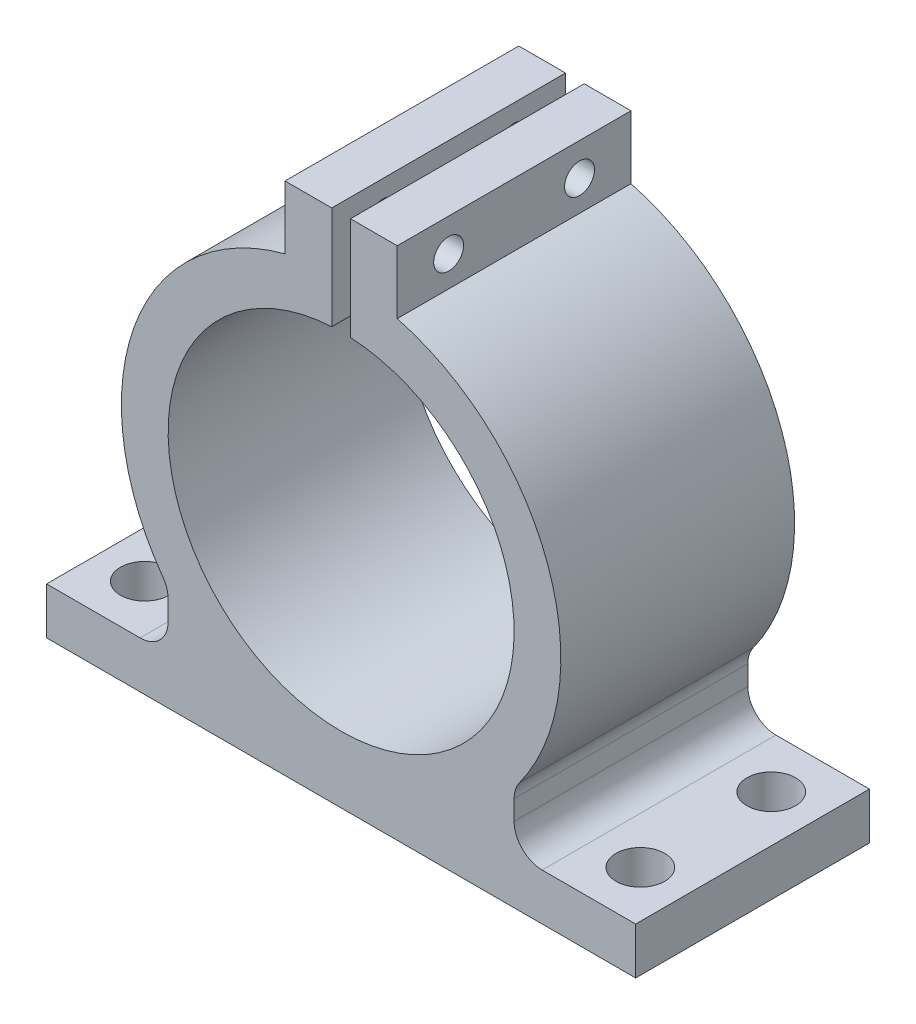
ISO-10303-21;
HEADER;
FILE_DESCRIPTION(('STEP AP214'),'2;1');
FILE_NAME('part.step','',(''),(''),'','','');
FILE_SCHEMA(('AUTOMOTIVE_DESIGN { 1 0 10303 214 1 1 1 1 }'));
ENDSEC;
DATA;
#1=APPLICATION_CONTEXT('core data for automotive mechanical design processes');
#2=APPLICATION_PROTOCOL_DEFINITION('international standard','automotive_design',2000,#1);
#3=PRODUCT_CONTEXT('',#1,'mechanical');
#4=PRODUCT('Part','Part','',(#3));
#5=PRODUCT_RELATED_PRODUCT_CATEGORY('part','',(#4));
#6=PRODUCT_DEFINITION_FORMATION('','',#4);
#7=PRODUCT_DEFINITION_CONTEXT('part definition',#1,'design');
#8=PRODUCT_DEFINITION('design','',#6,#7);
#9=PRODUCT_DEFINITION_SHAPE('','',#8);
#10=(LENGTH_UNIT() NAMED_UNIT(*) SI_UNIT(.MILLI.,.METRE.));
#11=(NAMED_UNIT(*) PLANE_ANGLE_UNIT() SI_UNIT($,.RADIAN.));
#12=(NAMED_UNIT(*) SI_UNIT($,.STERADIAN.) SOLID_ANGLE_UNIT());
#13=UNCERTAINTY_MEASURE_WITH_UNIT(LENGTH_MEASURE(1.E-05),#10,'distance_accuracy_value','');
#14=(GEOMETRIC_REPRESENTATION_CONTEXT(3) GLOBAL_UNCERTAINTY_ASSIGNED_CONTEXT((#13)) GLOBAL_UNIT_ASSIGNED_CONTEXT((#10,
#11,#12)) REPRESENTATION_CONTEXT('',''));
#15=CARTESIAN_POINT('',(0.,0.,0.));
#16=DIRECTION('',(0.,0.,1.));
#17=DIRECTION('',(1.,0.,0.));
#18=AXIS2_PLACEMENT_3D('',#15,#16,#17);
#19=CARTESIAN_POINT('',(-18.5,-25.6,25.));
#20=DIRECTION('',(1.,0.,0.));
#21=DIRECTION('',(0.,0.,-1.));
#22=AXIS2_PLACEMENT_3D('',#19,#20,#21);
#23=PLANE('',#22);
#24=DIRECTION('',(0.,-1.,0.));
#25=VECTOR('',#24,1.);
#26=CARTESIAN_POINT('',(-18.5,-25.6,25.));
#27=LINE('',#26,#25);
#28=CARTESIAN_POINT('',(-18.5,-15.4919333848297,25.));
#29=VERTEX_POINT('',#28);
#30=CARTESIAN_POINT('',(-18.5,-17.6,25.));
#31=VERTEX_POINT('',#30);
#32=EDGE_CURVE('E190',#29,#31,#27,.T.);
#33=ORIENTED_EDGE('',*,*,#32,.F.);
#34=DIRECTION('',(0.,0.,1.));
#35=VECTOR('',#34,1.);
#36=CARTESIAN_POINT('',(-18.5,-15.4919333848297,0.));
#37=LINE('',#36,#35);
#38=CARTESIAN_POINT('',(-18.5,-15.4919333848297,0.));
#39=VERTEX_POINT('',#38);
#40=EDGE_CURVE('E316',#29,#39,#37,.F.);
#41=ORIENTED_EDGE('',*,*,#40,.T.);
#42=DIRECTION('',(0.,-1.,0.));
#43=VECTOR('',#42,1.);
#44=CARTESIAN_POINT('',(-18.5,-25.6,0.));
#45=LINE('',#44,#43);
#46=CARTESIAN_POINT('',(-18.5,-17.6,0.));
#47=VERTEX_POINT('',#46);
#48=EDGE_CURVE('E277',#39,#47,#45,.T.);
#49=ORIENTED_EDGE('',*,*,#48,.T.);
#50=DIRECTION('',(0.,0.,-1.));
#51=VECTOR('',#50,1.);
#52=CARTESIAN_POINT('',(-18.5,-17.6,25.));
#53=LINE('',#52,#51);
#54=EDGE_CURVE('E314',#47,#31,#53,.F.);
#55=ORIENTED_EDGE('',*,*,#54,.T.);
#56=EDGE_LOOP('',(#33,#41,#49,#55));
#57=FACE_BOUND('',#56,.T.);
#58=ADVANCED_FACE('F39',(#57),#23,.F.);
#59=CARTESIAN_POINT('',(0.,0.,25.));
#60=DIRECTION('',(0.,0.,-1.));
#61=DIRECTION('',(-1.,0.,0.));
#62=AXIS2_PLACEMENT_3D('',#59,#60,#61);
#63=CYLINDRICAL_SURFACE('',#62,18.5);
#64=CARTESIAN_POINT('',(0.,0.,0.));
#65=DIRECTION('',(0.,0.,-1.));
#66=DIRECTION('',(-1.,0.,0.));
#67=AXIS2_PLACEMENT_3D('',#64,#65,#66);
#68=CIRCLE('',#67,18.5);
#69=CARTESIAN_POINT('',(0.999999999999998,18.4729532019112,0.));
#70=VERTEX_POINT('',#69);
#71=CARTESIAN_POINT('',(-1.,18.4729532019112,0.));
#72=VERTEX_POINT('',#71);
#73=EDGE_CURVE('E240',#70,#72,#68,.T.);
#74=ORIENTED_EDGE('',*,*,#73,.T.);
#75=DIRECTION('',(0.,0.,-1.));
#76=VECTOR('',#75,1.);
#77=CARTESIAN_POINT('',(-1.,18.4729532019112,25.));
#78=LINE('',#77,#76);
#79=CARTESIAN_POINT('',(-1.,18.4729532019112,25.));
#80=VERTEX_POINT('',#79);
#81=EDGE_CURVE('E311',#80,#72,#78,.T.);
#82=ORIENTED_EDGE('',*,*,#81,.F.);
#83=CARTESIAN_POINT('',(0.,0.,25.));
#84=DIRECTION('',(0.,0.,-1.));
#85=DIRECTION('',(-1.,0.,0.));
#86=AXIS2_PLACEMENT_3D('',#83,#84,#85);
#87=CIRCLE('',#86,18.5);
#88=CARTESIAN_POINT('',(0.999999999999998,18.4729532019112,25.));
#89=VERTEX_POINT('',#88);
#90=EDGE_CURVE('E241',#89,#80,#87,.T.);
#91=ORIENTED_EDGE('',*,*,#90,.F.);
#92=DIRECTION('',(0.,0.,-1.));
#93=VECTOR('',#92,1.);
#94=CARTESIAN_POINT('',(0.999999999999998,18.4729532019112,25.));
#95=LINE('',#94,#93);
#96=EDGE_CURVE('E265',#89,#70,#95,.T.);
#97=ORIENTED_EDGE('',*,*,#96,.T.);
#98=EDGE_LOOP('',(#74,#82,#91,#97));
#99=FACE_BOUND('',#98,.T.);
#100=ADVANCED_FACE('F397',(#99),#63,.F.);
#101=CARTESIAN_POINT('',(-1.,18.4729532019112,25.));
#102=DIRECTION('',(-1.,0.,0.));
#103=DIRECTION('',(0.,-1.,0.));
#104=AXIS2_PLACEMENT_3D('',#101,#102,#103);
#105=PLANE('',#104);
#106=CARTESIAN_POINT('',(-1.,25.9729532019112,19.5));
#107=DIRECTION('',(-1.,0.,0.));
#108=DIRECTION('',(0.,-1.,0.));
#109=AXIS2_PLACEMENT_3D('',#106,#107,#108);
#110=CIRCLE('',#109,1.6);
#111=CARTESIAN_POINT('',(-1.,24.3729532019112,19.5));
#112=VERTEX_POINT('',#111);
#113=EDGE_CURVE('E367',#112,#112,#110,.T.);
#114=ORIENTED_EDGE('',*,*,#113,.T.);
#115=EDGE_LOOP('',(#114));
#116=FACE_BOUND('',#115,.T.);
#117=CARTESIAN_POINT('',(-1.,25.9729532019112,5.5));
#118=DIRECTION('',(-1.,0.,0.));
#119=DIRECTION('',(0.,-1.,0.));
#120=AXIS2_PLACEMENT_3D('',#117,#118,#119);
#121=CIRCLE('',#120,1.6);
#122=CARTESIAN_POINT('',(-1.,24.3729532019112,5.5));
#123=VERTEX_POINT('',#122);
#124=EDGE_CURVE('E352',#123,#123,#121,.T.);
#125=ORIENTED_EDGE('',*,*,#124,.T.);
#126=EDGE_LOOP('',(#125));
#127=FACE_BOUND('',#126,.T.);
#128=DIRECTION('',(0.,1.,0.));
#129=VECTOR('',#128,1.);
#130=CARTESIAN_POINT('',(-1.,18.4729532019112,0.));
#131=LINE('',#130,#129);
#132=CARTESIAN_POINT('',(-1.00000000000001,29.4729532019112,0.));
#133=VERTEX_POINT('',#132);
#134=EDGE_CURVE('E268',#72,#133,#131,.T.);
#135=ORIENTED_EDGE('',*,*,#134,.T.);
#136=DIRECTION('',(0.,0.,-1.));
#137=VECTOR('',#136,1.);
#138=CARTESIAN_POINT('',(-1.00000000000001,29.4729532019112,25.));
#139=LINE('',#138,#137);
#140=CARTESIAN_POINT('',(-1.00000000000001,29.4729532019112,25.));
#141=VERTEX_POINT('',#140);
#142=EDGE_CURVE('E308',#141,#133,#139,.T.);
#143=ORIENTED_EDGE('',*,*,#142,.F.);
#144=DIRECTION('',(0.,1.,0.));
#145=VECTOR('',#144,1.);
#146=CARTESIAN_POINT('',(-1.,18.4729532019112,25.));
#147=LINE('',#146,#145);
#148=EDGE_CURVE('E243',#80,#141,#147,.T.);
#149=ORIENTED_EDGE('',*,*,#148,.F.);
#150=ORIENTED_EDGE('',*,*,#81,.T.);
#151=EDGE_LOOP('',(#135,#143,#149,#150));
#152=FACE_BOUND('',#151,.T.);
#153=ADVANCED_FACE('F403',(#116,#127,#152),#105,.F.);
#154=CARTESIAN_POINT('',(-1.00000000000001,29.4729532019112,25.));
#155=DIRECTION('',(0.,-1.,0.));
#156=DIRECTION('',(0.,0.,-1.));
#157=AXIS2_PLACEMENT_3D('',#154,#155,#156);
#158=PLANE('',#157);
#159=DIRECTION('',(-1.,0.,0.));
#160=VECTOR('',#159,1.);
#161=CARTESIAN_POINT('',(-1.00000000000001,29.4729532019112,0.));
#162=LINE('',#161,#160);
#163=CARTESIAN_POINT('',(-6.00000000000001,29.4729532019112,0.));
#164=VERTEX_POINT('',#163);
#165=EDGE_CURVE('E270',#133,#164,#162,.T.);
#166=ORIENTED_EDGE('',*,*,#165,.T.);
#167=DIRECTION('',(0.,0.,-1.));
#168=VECTOR('',#167,1.);
#169=CARTESIAN_POINT('',(-6.00000000000001,29.4729532019112,25.));
#170=LINE('',#169,#168);
#171=CARTESIAN_POINT('',(-6.00000000000001,29.4729532019112,25.));
#172=VERTEX_POINT('',#171);
#173=EDGE_CURVE('E305',#172,#164,#170,.T.);
#174=ORIENTED_EDGE('',*,*,#173,.F.);
#175=DIRECTION('',(-1.,0.,0.));
#176=VECTOR('',#175,1.);
#177=CARTESIAN_POINT('',(-1.00000000000001,29.4729532019112,25.));
#178=LINE('',#177,#176);
#179=EDGE_CURVE('E246',#141,#172,#178,.T.);
#180=ORIENTED_EDGE('',*,*,#179,.F.);
#181=ORIENTED_EDGE('',*,*,#142,.T.);
#182=EDGE_LOOP('',(#166,#174,#180,#181));
#183=FACE_BOUND('',#182,.T.);
#184=ADVANCED_FACE('F417',(#183),#158,.F.);
#185=CARTESIAN_POINT('',(-6.00000000000001,29.4729532019112,25.));
#186=DIRECTION('',(1.,0.,0.));
#187=DIRECTION('',(0.,1.,0.));
#188=AXIS2_PLACEMENT_3D('',#185,#186,#187);
#189=PLANE('',#188);
#190=CARTESIAN_POINT('',(-6.00000000000001,25.9729532019112,19.5));
#191=DIRECTION('',(-1.,0.,0.));
#192=DIRECTION('',(0.,-1.,0.));
#193=AXIS2_PLACEMENT_3D('',#190,#191,#192);
#194=CIRCLE('',#193,1.6);
#195=CARTESIAN_POINT('',(-6.00000000000001,24.3729532019112,19.5));
#196=VERTEX_POINT('',#195);
#197=EDGE_CURVE('E348',#196,#196,#194,.T.);
#198=ORIENTED_EDGE('',*,*,#197,.F.);
#199=EDGE_LOOP('',(#198));
#200=FACE_BOUND('',#199,.T.);
#201=CARTESIAN_POINT('',(-6.00000000000001,25.9729532019112,5.5));
#202=DIRECTION('',(-1.,0.,0.));
#203=DIRECTION('',(0.,-1.,0.));
#204=AXIS2_PLACEMENT_3D('',#201,#202,#203);
#205=CIRCLE('',#204,1.6);
#206=CARTESIAN_POINT('',(-6.00000000000001,24.3729532019112,5.5));
#207=VERTEX_POINT('',#206);
#208=EDGE_CURVE('E355',#207,#207,#205,.T.);
#209=ORIENTED_EDGE('',*,*,#208,.F.);
#210=EDGE_LOOP('',(#209));
#211=FACE_BOUND('',#210,.T.);
#212=DIRECTION('',(0.,-1.,0.));
#213=VECTOR('',#212,1.);
#214=CARTESIAN_POINT('',(-6.00000000000001,29.4729532019112,0.));
#215=LINE('',#214,#213);
#216=CARTESIAN_POINT('',(-6.,22.7211355350035,0.));
#217=VERTEX_POINT('',#216);
#218=EDGE_CURVE('E272',#164,#217,#215,.T.);
#219=ORIENTED_EDGE('',*,*,#218,.T.);
#220=DIRECTION('',(0.,0.,-1.));
#221=VECTOR('',#220,1.);
#222=CARTESIAN_POINT('',(-6.,22.7211355350035,25.));
#223=LINE('',#222,#221);
#224=CARTESIAN_POINT('',(-6.,22.7211355350035,25.));
#225=VERTEX_POINT('',#224);
#226=EDGE_CURVE('E302',#225,#217,#223,.T.);
#227=ORIENTED_EDGE('',*,*,#226,.F.);
#228=DIRECTION('',(0.,-1.,0.));
#229=VECTOR('',#228,1.);
#230=CARTESIAN_POINT('',(-6.00000000000001,29.4729532019112,25.));
#231=LINE('',#230,#229);
#232=EDGE_CURVE('E248',#172,#225,#231,.T.);
#233=ORIENTED_EDGE('',*,*,#232,.F.);
#234=ORIENTED_EDGE('',*,*,#173,.T.);
#235=EDGE_LOOP('',(#219,#227,#233,#234));
#236=FACE_BOUND('',#235,.T.);
#237=ADVANCED_FACE('F413',(#200,#211,#236),#189,.F.);
#238=CARTESIAN_POINT('',(0.,0.,25.));
#239=DIRECTION('',(0.,0.,-1.));
#240=DIRECTION('',(-1.,0.,0.));
#241=AXIS2_PLACEMENT_3D('',#238,#239,#240);
#242=CYLINDRICAL_SURFACE('',#241,23.5);
#243=CARTESIAN_POINT('',(0.,0.,0.));
#244=DIRECTION('',(0.,0.,1.));
#245=DIRECTION('',(-1.,0.,0.));
#246=AXIS2_PLACEMENT_3D('',#243,#244,#245);
#247=CIRCLE('',#246,23.5);
#248=CARTESIAN_POINT('',(-19.0660377358491,-13.738129605415,0.));
#249=VERTEX_POINT('',#248);
#250=EDGE_CURVE('E274',#217,#249,#247,.T.);
#251=ORIENTED_EDGE('',*,*,#250,.T.);
#252=DIRECTION('',(0.,0.,-1.));
#253=VECTOR('',#252,1.);
#254=CARTESIAN_POINT('',(-19.0660377358491,-13.738129605415,25.));
#255=LINE('',#254,#253);
#256=CARTESIAN_POINT('',(-19.0660377358491,-13.738129605415,25.));
#257=VERTEX_POINT('',#256);
#258=EDGE_CURVE('E319',#249,#257,#255,.F.);
#259=ORIENTED_EDGE('',*,*,#258,.T.);
#260=CARTESIAN_POINT('',(0.,0.,25.));
#261=DIRECTION('',(0.,0.,1.));
#262=DIRECTION('',(-1.,0.,0.));
#263=AXIS2_PLACEMENT_3D('',#260,#261,#262);
#264=CIRCLE('',#263,23.5);
#265=EDGE_CURVE('E250',#225,#257,#264,.T.);
#266=ORIENTED_EDGE('',*,*,#265,.F.);
#267=ORIENTED_EDGE('',*,*,#226,.T.);
#268=EDGE_LOOP('',(#251,#259,#266,#267));
#269=FACE_BOUND('',#268,.T.);
#270=ADVANCED_FACE('F410',(#269),#242,.T.);
#271=CARTESIAN_POINT('',(-18.5,-25.6,25.));
#272=DIRECTION('',(0.,1.,0.));
#273=DIRECTION('',(-1.,0.,0.));
#274=AXIS2_PLACEMENT_3D('',#271,#272,#273);
#275=PLANE('',#274);
#276=CARTESIAN_POINT('',(26.5,-25.6,19.5));
#277=DIRECTION('',(0.,-1.,0.));
#278=DIRECTION('',(0.,0.,1.));
#279=AXIS2_PLACEMENT_3D('',#276,#277,#278);
#280=CIRCLE('',#279,2.6);
#281=CARTESIAN_POINT('',(26.5,-25.6,22.1));
#282=VERTEX_POINT('',#281);
#283=EDGE_CURVE('E200',#282,#282,#280,.T.);
#284=ORIENTED_EDGE('',*,*,#283,.F.);
#285=EDGE_LOOP('',(#284));
#286=FACE_BOUND('',#285,.T.);
#287=CARTESIAN_POINT('',(26.5,-25.6,5.5));
#288=DIRECTION('',(0.,-1.,0.));
#289=DIRECTION('',(0.,0.,1.));
#290=AXIS2_PLACEMENT_3D('',#287,#288,#289);
#291=CIRCLE('',#290,2.6);
#292=CARTESIAN_POINT('',(26.5,-25.6,8.1));
#293=VERTEX_POINT('',#292);
#294=EDGE_CURVE('E376',#293,#293,#291,.T.);
#295=ORIENTED_EDGE('',*,*,#294,.F.);
#296=EDGE_LOOP('',(#295));
#297=FACE_BOUND('',#296,.T.);
#298=CARTESIAN_POINT('',(-26.5,-25.6,19.5));
#299=DIRECTION('',(0.,1.,0.));
#300=DIRECTION('',(0.,0.,1.));
#301=AXIS2_PLACEMENT_3D('',#298,#299,#300);
#302=CIRCLE('',#301,2.6);
#303=CARTESIAN_POINT('',(-26.5,-25.6,22.1));
#304=VERTEX_POINT('',#303);
#305=EDGE_CURVE('E215',#304,#304,#302,.T.);
#306=ORIENTED_EDGE('',*,*,#305,.T.);
#307=EDGE_LOOP('',(#306));
#308=FACE_BOUND('',#307,.T.);
#309=CARTESIAN_POINT('',(-26.5,-25.6,5.5));
#310=DIRECTION('',(0.,1.,0.));
#311=DIRECTION('',(0.,0.,1.));
#312=AXIS2_PLACEMENT_3D('',#309,#310,#311);
#313=CIRCLE('',#312,2.6);
#314=CARTESIAN_POINT('',(-26.5,-25.6,8.1));
#315=VERTEX_POINT('',#314);
#316=EDGE_CURVE('E214',#315,#315,#313,.T.);
#317=ORIENTED_EDGE('',*,*,#316,.T.);
#318=EDGE_LOOP('',(#317));
#319=FACE_BOUND('',#318,.T.);
#320=DIRECTION('',(1.,0.,0.));
#321=VECTOR('',#320,1.);
#322=CARTESIAN_POINT('',(-18.5,-25.6,0.));
#323=LINE('',#322,#321);
#324=CARTESIAN_POINT('',(-31.5,-25.6,0.));
#325=VERTEX_POINT('',#324);
#326=CARTESIAN_POINT('',(31.5,-25.6,0.));
#327=VERTEX_POINT('',#326);
#328=EDGE_CURVE('E203',#325,#327,#323,.T.);
#329=ORIENTED_EDGE('',*,*,#328,.T.);
#330=DIRECTION('',(0.,0.,1.));
#331=VECTOR('',#330,1.);
#332=CARTESIAN_POINT('',(31.5,-25.6,25.));
#333=LINE('',#332,#331);
#334=CARTESIAN_POINT('',(31.5,-25.6,25.));
#335=VERTEX_POINT('',#334);
#336=EDGE_CURVE('E196',#327,#335,#333,.T.);
#337=ORIENTED_EDGE('',*,*,#336,.T.);
#338=DIRECTION('',(1.,0.,0.));
#339=VECTOR('',#338,1.);
#340=CARTESIAN_POINT('',(-18.5,-25.6,25.));
#341=LINE('',#340,#339);
#342=CARTESIAN_POINT('',(-31.5,-25.6,25.));
#343=VERTEX_POINT('',#342);
#344=EDGE_CURVE('E176',#343,#335,#341,.T.);
#345=ORIENTED_EDGE('',*,*,#344,.F.);
#346=DIRECTION('',(0.,0.,1.));
#347=VECTOR('',#346,1.);
#348=CARTESIAN_POINT('',(-31.5,-25.6,25.));
#349=LINE('',#348,#347);
#350=EDGE_CURVE('E232',#325,#343,#349,.T.);
#351=ORIENTED_EDGE('',*,*,#350,.F.);
#352=EDGE_LOOP('',(#329,#337,#345,#351));
#353=FACE_BOUND('',#352,.T.);
#354=ADVANCED_FACE('F202',(#286,#297,#308,#319,#353),#275,.F.);
#355=CARTESIAN_POINT('',(18.5,-25.6,25.));
#356=DIRECTION('',(-1.,0.,0.));
#357=DIRECTION('',(0.,-1.,0.));
#358=AXIS2_PLACEMENT_3D('',#355,#356,#357);
#359=PLANE('',#358);
#360=DIRECTION('',(0.,1.,0.));
#361=VECTOR('',#360,1.);
#362=CARTESIAN_POINT('',(18.5,-25.6,0.));
#363=LINE('',#362,#361);
#364=CARTESIAN_POINT('',(18.5,-17.6,0.));
#365=VERTEX_POINT('',#364);
#366=CARTESIAN_POINT('',(18.5,-15.4919333848297,0.));
#367=VERTEX_POINT('',#366);
#368=EDGE_CURVE('E281',#365,#367,#363,.T.);
#369=ORIENTED_EDGE('',*,*,#368,.T.);
#370=DIRECTION('',(0.,0.,1.));
#371=VECTOR('',#370,1.);
#372=CARTESIAN_POINT('',(18.5,-15.4919333848297,25.));
#373=LINE('',#372,#371);
#374=CARTESIAN_POINT('',(18.5,-15.4919333848297,25.));
#375=VERTEX_POINT('',#374);
#376=EDGE_CURVE('E338',#367,#375,#373,.T.);
#377=ORIENTED_EDGE('',*,*,#376,.T.);
#378=DIRECTION('',(0.,1.,0.));
#379=VECTOR('',#378,1.);
#380=CARTESIAN_POINT('',(18.5,-25.6,25.));
#381=LINE('',#380,#379);
#382=CARTESIAN_POINT('',(18.5,-17.6,25.));
#383=VERTEX_POINT('',#382);
#384=EDGE_CURVE('E189',#383,#375,#381,.T.);
#385=ORIENTED_EDGE('',*,*,#384,.F.);
#386=DIRECTION('',(0.,0.,-1.));
#387=VECTOR('',#386,1.);
#388=CARTESIAN_POINT('',(18.5,-17.6,25.));
#389=LINE('',#388,#387);
#390=EDGE_CURVE('E335',#383,#365,#389,.T.);
#391=ORIENTED_EDGE('',*,*,#390,.T.);
#392=EDGE_LOOP('',(#369,#377,#385,#391));
#393=FACE_BOUND('',#392,.T.);
#394=ADVANCED_FACE('F495',(#393),#359,.F.);
#395=CARTESIAN_POINT('',(0.,0.,25.));
#396=DIRECTION('',(0.,0.,-1.));
#397=DIRECTION('',(-1.,0.,0.));
#398=AXIS2_PLACEMENT_3D('',#395,#396,#397);
#399=CYLINDRICAL_SURFACE('',#398,23.5);
#400=CARTESIAN_POINT('',(0.,0.,25.));
#401=DIRECTION('',(0.,0.,1.));
#402=DIRECTION('',(1.,0.,0.));
#403=AXIS2_PLACEMENT_3D('',#400,#401,#402);
#404=CIRCLE('',#403,23.5);
#405=CARTESIAN_POINT('',(19.0660377358491,-13.738129605415,25.));
#406=VERTEX_POINT('',#405);
#407=CARTESIAN_POINT('',(5.99999999999999,22.7211355350035,25.));
#408=VERTEX_POINT('',#407);
#409=EDGE_CURVE('E257',#406,#408,#404,.T.);
#410=ORIENTED_EDGE('',*,*,#409,.F.);
#411=DIRECTION('',(0.,0.,-1.));
#412=VECTOR('',#411,1.);
#413=CARTESIAN_POINT('',(19.0660377358491,-13.738129605415,25.));
#414=LINE('',#413,#412);
#415=CARTESIAN_POINT('',(19.0660377358491,-13.738129605415,0.));
#416=VERTEX_POINT('',#415);
#417=EDGE_CURVE('E332',#406,#416,#414,.T.);
#418=ORIENTED_EDGE('',*,*,#417,.T.);
#419=CARTESIAN_POINT('',(0.,0.,0.));
#420=DIRECTION('',(0.,0.,1.));
#421=DIRECTION('',(1.,0.,0.));
#422=AXIS2_PLACEMENT_3D('',#419,#420,#421);
#423=CIRCLE('',#422,23.5);
#424=CARTESIAN_POINT('',(5.99999999999999,22.7211355350035,0.));
#425=VERTEX_POINT('',#424);
#426=EDGE_CURVE('E284',#416,#425,#423,.T.);
#427=ORIENTED_EDGE('',*,*,#426,.T.);
#428=DIRECTION('',(0.,0.,-1.));
#429=VECTOR('',#428,1.);
#430=CARTESIAN_POINT('',(5.99999999999999,22.7211355350035,25.));
#431=LINE('',#430,#429);
#432=EDGE_CURVE('E299',#408,#425,#431,.T.);
#433=ORIENTED_EDGE('',*,*,#432,.F.);
#434=EDGE_LOOP('',(#410,#418,#427,#433));
#435=FACE_BOUND('',#434,.T.);
#436=ADVANCED_FACE('F448',(#435),#399,.T.);
#437=CARTESIAN_POINT('',(6.,29.4729532019112,25.));
#438=DIRECTION('',(-1.,0.,0.));
#439=DIRECTION('',(0.,-1.,0.));
#440=AXIS2_PLACEMENT_3D('',#437,#438,#439);
#441=PLANE('',#440);
#442=CARTESIAN_POINT('',(6.,25.9729532019112,19.5));
#443=DIRECTION('',(-1.,0.,0.));
#444=DIRECTION('',(0.,-1.,0.));
#445=AXIS2_PLACEMENT_3D('',#442,#443,#444);
#446=CIRCLE('',#445,1.6);
#447=CARTESIAN_POINT('',(6.,24.3729532019112,19.5));
#448=VERTEX_POINT('',#447);
#449=EDGE_CURVE('E364',#448,#448,#446,.T.);
#450=ORIENTED_EDGE('',*,*,#449,.T.);
#451=EDGE_LOOP('',(#450));
#452=FACE_BOUND('',#451,.T.);
#453=CARTESIAN_POINT('',(6.,25.9729532019112,5.5));
#454=DIRECTION('',(-1.,0.,0.));
#455=DIRECTION('',(0.,-1.,0.));
#456=AXIS2_PLACEMENT_3D('',#453,#454,#455);
#457=CIRCLE('',#456,1.6);
#458=CARTESIAN_POINT('',(6.,24.3729532019112,5.5));
#459=VERTEX_POINT('',#458);
#460=EDGE_CURVE('E347',#459,#459,#457,.T.);
#461=ORIENTED_EDGE('',*,*,#460,.T.);
#462=EDGE_LOOP('',(#461));
#463=FACE_BOUND('',#462,.T.);
#464=DIRECTION('',(0.,1.,0.));
#465=VECTOR('',#464,1.);
#466=CARTESIAN_POINT('',(6.,29.4729532019112,0.));
#467=LINE('',#466,#465);
#468=CARTESIAN_POINT('',(6.,29.4729532019112,0.));
#469=VERTEX_POINT('',#468);
#470=EDGE_CURVE('E286',#425,#469,#467,.T.);
#471=ORIENTED_EDGE('',*,*,#470,.T.);
#472=DIRECTION('',(0.,0.,-1.));
#473=VECTOR('',#472,1.);
#474=CARTESIAN_POINT('',(6.,29.4729532019112,25.));
#475=LINE('',#474,#473);
#476=CARTESIAN_POINT('',(6.,29.4729532019112,25.));
#477=VERTEX_POINT('',#476);
#478=EDGE_CURVE('E296',#477,#469,#475,.T.);
#479=ORIENTED_EDGE('',*,*,#478,.F.);
#480=DIRECTION('',(0.,1.,0.));
#481=VECTOR('',#480,1.);
#482=CARTESIAN_POINT('',(6.,29.4729532019112,25.));
#483=LINE('',#482,#481);
#484=EDGE_CURVE('E259',#408,#477,#483,.T.);
#485=ORIENTED_EDGE('',*,*,#484,.F.);
#486=ORIENTED_EDGE('',*,*,#432,.T.);
#487=EDGE_LOOP('',(#471,#479,#485,#486));
#488=FACE_BOUND('',#487,.T.);
#489=ADVANCED_FACE('F454',(#452,#463,#488),#441,.F.);
#490=CARTESIAN_POINT('',(0.999999999999998,29.4729532019112,25.));
#491=DIRECTION('',(0.,-1.,0.));
#492=DIRECTION('',(0.,0.,-1.));
#493=AXIS2_PLACEMENT_3D('',#490,#491,#492);
#494=PLANE('',#493);
#495=DIRECTION('',(-1.,0.,0.));
#496=VECTOR('',#495,1.);
#497=CARTESIAN_POINT('',(0.999999999999998,29.4729532019112,0.));
#498=LINE('',#497,#496);
#499=CARTESIAN_POINT('',(0.999999999999998,29.4729532019112,0.));
#500=VERTEX_POINT('',#499);
#501=EDGE_CURVE('E288',#469,#500,#498,.T.);
#502=ORIENTED_EDGE('',*,*,#501,.T.);
#503=DIRECTION('',(0.,0.,-1.));
#504=VECTOR('',#503,1.);
#505=CARTESIAN_POINT('',(0.999999999999998,29.4729532019112,25.));
#506=LINE('',#505,#504);
#507=CARTESIAN_POINT('',(0.999999999999998,29.4729532019112,25.));
#508=VERTEX_POINT('',#507);
#509=EDGE_CURVE('E293',#508,#500,#506,.T.);
#510=ORIENTED_EDGE('',*,*,#509,.F.);
#511=DIRECTION('',(-1.,0.,0.));
#512=VECTOR('',#511,1.);
#513=CARTESIAN_POINT('',(0.999999999999998,29.4729532019112,25.));
#514=LINE('',#513,#512);
#515=EDGE_CURVE('E261',#477,#508,#514,.T.);
#516=ORIENTED_EDGE('',*,*,#515,.F.);
#517=ORIENTED_EDGE('',*,*,#478,.T.);
#518=EDGE_LOOP('',(#502,#510,#516,#517));
#519=FACE_BOUND('',#518,.T.);
#520=ADVANCED_FACE('F460',(#519),#494,.F.);
#521=CARTESIAN_POINT('',(0.999999999999998,18.4729532019112,25.));
#522=DIRECTION('',(1.,0.,0.));
#523=DIRECTION('',(0.,0.,-1.));
#524=AXIS2_PLACEMENT_3D('',#521,#522,#523);
#525=PLANE('',#524);
#526=CARTESIAN_POINT('',(0.999999999999997,25.9729532019112,19.5));
#527=DIRECTION('',(1.,0.,0.));
#528=DIRECTION('',(0.,0.,-1.));
#529=AXIS2_PLACEMENT_3D('',#526,#527,#528);
#530=CIRCLE('',#529,1.6);
#531=CARTESIAN_POINT('',(0.999999999999997,25.9729532019112,17.9));
#532=VERTEX_POINT('',#531);
#533=EDGE_CURVE('E43',#532,#532,#530,.T.);
#534=ORIENTED_EDGE('',*,*,#533,.T.);
#535=EDGE_LOOP('',(#534));
#536=FACE_BOUND('',#535,.T.);
#537=CARTESIAN_POINT('',(0.999999999999997,25.9729532019112,5.5));
#538=DIRECTION('',(1.,0.,0.));
#539=DIRECTION('',(0.,0.,-1.));
#540=AXIS2_PLACEMENT_3D('',#537,#538,#539);
#541=CIRCLE('',#540,1.6);
#542=CARTESIAN_POINT('',(0.999999999999997,25.9729532019112,3.9));
#543=VERTEX_POINT('',#542);
#544=EDGE_CURVE('E345',#543,#543,#541,.T.);
#545=ORIENTED_EDGE('',*,*,#544,.T.);
#546=EDGE_LOOP('',(#545));
#547=FACE_BOUND('',#546,.T.);
#548=DIRECTION('',(0.,-1.,0.));
#549=VECTOR('',#548,1.);
#550=CARTESIAN_POINT('',(0.999999999999998,18.4729532019112,0.));
#551=LINE('',#550,#549);
#552=EDGE_CURVE('E244',#500,#70,#551,.T.);
#553=ORIENTED_EDGE('',*,*,#552,.T.);
#554=ORIENTED_EDGE('',*,*,#96,.F.);
#555=DIRECTION('',(0.,-1.,0.));
#556=VECTOR('',#555,1.);
#557=CARTESIAN_POINT('',(0.999999999999998,18.4729532019112,25.));
#558=LINE('',#557,#556);
#559=EDGE_CURVE('E263',#508,#89,#558,.T.);
#560=ORIENTED_EDGE('',*,*,#559,.F.);
#561=ORIENTED_EDGE('',*,*,#509,.T.);
#562=EDGE_LOOP('',(#553,#554,#560,#561));
#563=FACE_BOUND('',#562,.T.);
#564=ADVANCED_FACE('F464',(#536,#547,#563),#525,.F.);
#565=CARTESIAN_POINT('',(0.,0.,25.));
#566=DIRECTION('',(0.,0.,-1.));
#567=DIRECTION('',(-1.,0.,0.));
#568=AXIS2_PLACEMENT_3D('',#565,#566,#567);
#569=PLANE('',#568);
#570=ORIENTED_EDGE('',*,*,#90,.T.);
#571=ORIENTED_EDGE('',*,*,#148,.T.);
#572=ORIENTED_EDGE('',*,*,#179,.T.);
#573=ORIENTED_EDGE('',*,*,#232,.T.);
#574=ORIENTED_EDGE('',*,*,#265,.T.);
#575=CARTESIAN_POINT('',(-21.5,-15.4919333848297,25.));
#576=DIRECTION('',(0.,0.,-1.));
#577=DIRECTION('',(-1.,0.,0.));
#578=AXIS2_PLACEMENT_3D('',#575,#576,#577);
#579=CIRCLE('',#578,3.);
#580=EDGE_CURVE('E326',#257,#29,#579,.T.);
#581=ORIENTED_EDGE('',*,*,#580,.T.);
#582=ORIENTED_EDGE('',*,*,#32,.T.);
#583=CARTESIAN_POINT('',(-21.5,-17.6,25.));
#584=DIRECTION('',(0.,0.,-1.));
#585=DIRECTION('',(-1.,0.,0.));
#586=AXIS2_PLACEMENT_3D('',#583,#584,#585);
#587=CIRCLE('',#586,3.);
#588=CARTESIAN_POINT('',(-21.5,-20.6,25.));
#589=VERTEX_POINT('',#588);
#590=EDGE_CURVE('E330',#31,#589,#587,.T.);
#591=ORIENTED_EDGE('',*,*,#590,.T.);
#592=DIRECTION('',(1.,0.,0.));
#593=VECTOR('',#592,1.);
#594=CARTESIAN_POINT('',(-31.5,-20.6,25.));
#595=LINE('',#594,#593);
#596=CARTESIAN_POINT('',(-31.5,-20.6,25.));
#597=VERTEX_POINT('',#596);
#598=EDGE_CURVE('E237',#597,#589,#595,.T.);
#599=ORIENTED_EDGE('',*,*,#598,.F.);
#600=DIRECTION('',(0.,1.,0.));
#601=VECTOR('',#600,1.);
#602=CARTESIAN_POINT('',(-31.5,-20.6,25.));
#603=LINE('',#602,#601);
#604=EDGE_CURVE('E184',#343,#597,#603,.T.);
#605=ORIENTED_EDGE('',*,*,#604,.F.);
#606=ORIENTED_EDGE('',*,*,#344,.T.);
#607=DIRECTION('',(0.,1.,0.));
#608=VECTOR('',#607,1.);
#609=CARTESIAN_POINT('',(31.5,-20.6,25.));
#610=LINE('',#609,#608);
#611=CARTESIAN_POINT('',(31.5,-20.6,25.));
#612=VERTEX_POINT('',#611);
#613=EDGE_CURVE('E180',#335,#612,#610,.T.);
#614=ORIENTED_EDGE('',*,*,#613,.T.);
#615=DIRECTION('',(-1.,0.,0.));
#616=VECTOR('',#615,1.);
#617=CARTESIAN_POINT('',(31.5,-20.6,25.));
#618=LINE('',#617,#616);
#619=CARTESIAN_POINT('',(21.5,-20.6,25.));
#620=VERTEX_POINT('',#619);
#621=EDGE_CURVE('E210',#612,#620,#618,.T.);
#622=ORIENTED_EDGE('',*,*,#621,.T.);
#623=CARTESIAN_POINT('',(21.5,-17.6,25.));
#624=DIRECTION('',(0.,0.,-1.));
#625=DIRECTION('',(-1.,0.,0.));
#626=AXIS2_PLACEMENT_3D('',#623,#624,#625);
#627=CIRCLE('',#626,3.);
#628=EDGE_CURVE('E11',#620,#383,#627,.T.);
#629=ORIENTED_EDGE('',*,*,#628,.T.);
#630=ORIENTED_EDGE('',*,*,#384,.T.);
#631=CARTESIAN_POINT('',(21.5,-15.4919333848297,25.));
#632=DIRECTION('',(0.,0.,-1.));
#633=DIRECTION('',(-1.,0.,0.));
#634=AXIS2_PLACEMENT_3D('',#631,#632,#633);
#635=CIRCLE('',#634,3.);
#636=EDGE_CURVE('E343',#375,#406,#635,.T.);
#637=ORIENTED_EDGE('',*,*,#636,.T.);
#638=ORIENTED_EDGE('',*,*,#409,.T.);
#639=ORIENTED_EDGE('',*,*,#484,.T.);
#640=ORIENTED_EDGE('',*,*,#515,.T.);
#641=ORIENTED_EDGE('',*,*,#559,.T.);
#642=EDGE_LOOP('',(#570,#571,#572,#573,#574,#581,#582,#591,#599,#605,#606,#614,#622,#629,#630,
#637,#638,#639,#640,#641));
#643=FACE_BOUND('',#642,.T.);
#644=ADVANCED_FACE('F179',(#643),#569,.F.);
#645=CARTESIAN_POINT('',(0.,0.,0.));
#646=DIRECTION('',(0.,0.,-1.));
#647=DIRECTION('',(-1.,0.,0.));
#648=AXIS2_PLACEMENT_3D('',#645,#646,#647);
#649=PLANE('',#648);
#650=ORIENTED_EDGE('',*,*,#73,.F.);
#651=ORIENTED_EDGE('',*,*,#552,.F.);
#652=ORIENTED_EDGE('',*,*,#501,.F.);
#653=ORIENTED_EDGE('',*,*,#470,.F.);
#654=ORIENTED_EDGE('',*,*,#426,.F.);
#655=CARTESIAN_POINT('',(21.5,-15.4919333848297,0.));
#656=DIRECTION('',(0.,0.,-1.));
#657=DIRECTION('',(-1.,0.,0.));
#658=AXIS2_PLACEMENT_3D('',#655,#656,#657);
#659=CIRCLE('',#658,3.);
#660=EDGE_CURVE('E341',#416,#367,#659,.F.);
#661=ORIENTED_EDGE('',*,*,#660,.T.);
#662=ORIENTED_EDGE('',*,*,#368,.F.);
#663=CARTESIAN_POINT('',(21.5,-17.6,0.));
#664=DIRECTION('',(0.,0.,-1.));
#665=DIRECTION('',(-1.,0.,0.));
#666=AXIS2_PLACEMENT_3D('',#663,#664,#665);
#667=CIRCLE('',#666,3.);
#668=CARTESIAN_POINT('',(21.5,-20.6,0.));
#669=VERTEX_POINT('',#668);
#670=EDGE_CURVE('E48',#365,#669,#667,.F.);
#671=ORIENTED_EDGE('',*,*,#670,.T.);
#672=DIRECTION('',(-1.,0.,0.));
#673=VECTOR('',#672,1.);
#674=CARTESIAN_POINT('',(31.5,-20.6,0.));
#675=LINE('',#674,#673);
#676=CARTESIAN_POINT('',(31.5,-20.6,0.));
#677=VERTEX_POINT('',#676);
#678=EDGE_CURVE('E212',#677,#669,#675,.T.);
#679=ORIENTED_EDGE('',*,*,#678,.F.);
#680=DIRECTION('',(0.,-1.,0.));
#681=VECTOR('',#680,1.);
#682=CARTESIAN_POINT('',(31.5,-20.6,0.));
#683=LINE('',#682,#681);
#684=EDGE_CURVE('E204',#677,#327,#683,.T.);
#685=ORIENTED_EDGE('',*,*,#684,.T.);
#686=ORIENTED_EDGE('',*,*,#328,.F.);
#687=DIRECTION('',(0.,-1.,0.));
#688=VECTOR('',#687,1.);
#689=CARTESIAN_POINT('',(-31.5,-20.6,0.));
#690=LINE('',#689,#688);
#691=CARTESIAN_POINT('',(-31.5,-20.6,0.));
#692=VERTEX_POINT('',#691);
#693=EDGE_CURVE('E229',#692,#325,#690,.T.);
#694=ORIENTED_EDGE('',*,*,#693,.F.);
#695=DIRECTION('',(1.,0.,0.));
#696=VECTOR('',#695,1.);
#697=CARTESIAN_POINT('',(-31.5,-20.6,0.));
#698=LINE('',#697,#696);
#699=CARTESIAN_POINT('',(-21.5,-20.6,0.));
#700=VERTEX_POINT('',#699);
#701=EDGE_CURVE('E234',#692,#700,#698,.T.);
#702=ORIENTED_EDGE('',*,*,#701,.T.);
#703=CARTESIAN_POINT('',(-21.5,-17.6,0.));
#704=DIRECTION('',(0.,0.,-1.));
#705=DIRECTION('',(-1.,0.,0.));
#706=AXIS2_PLACEMENT_3D('',#703,#704,#705);
#707=CIRCLE('',#706,3.);
#708=EDGE_CURVE('E328',#700,#47,#707,.F.);
#709=ORIENTED_EDGE('',*,*,#708,.T.);
#710=ORIENTED_EDGE('',*,*,#48,.F.);
#711=CARTESIAN_POINT('',(-21.5,-15.4919333848297,0.));
#712=DIRECTION('',(0.,0.,-1.));
#713=DIRECTION('',(-1.,0.,0.));
#714=AXIS2_PLACEMENT_3D('',#711,#712,#713);
#715=CIRCLE('',#714,3.);
#716=EDGE_CURVE('E324',#39,#249,#715,.F.);
#717=ORIENTED_EDGE('',*,*,#716,.T.);
#718=ORIENTED_EDGE('',*,*,#250,.F.);
#719=ORIENTED_EDGE('',*,*,#218,.F.);
#720=ORIENTED_EDGE('',*,*,#165,.F.);
#721=ORIENTED_EDGE('',*,*,#134,.F.);
#722=EDGE_LOOP('',(#650,#651,#652,#653,#654,#661,#662,#671,#679,#685,#686,#694,#702,#709,#710,
#717,#718,#719,#720,#721));
#723=FACE_BOUND('',#722,.T.);
#724=ADVANCED_FACE('F483',(#723),#649,.T.);
#725=CARTESIAN_POINT('',(-31.5,-20.6,25.));
#726=DIRECTION('',(0.,-1.,0.));
#727=DIRECTION('',(0.,0.,-1.));
#728=AXIS2_PLACEMENT_3D('',#725,#726,#727);
#729=PLANE('',#728);
#730=CARTESIAN_POINT('',(-26.5,-20.6,19.5));
#731=DIRECTION('',(0.,1.,0.));
#732=DIRECTION('',(0.,0.,1.));
#733=AXIS2_PLACEMENT_3D('',#730,#731,#732);
#734=CIRCLE('',#733,2.6);
#735=CARTESIAN_POINT('',(-26.5,-20.6,22.1));
#736=VERTEX_POINT('',#735);
#737=EDGE_CURVE('E218',#736,#736,#734,.T.);
#738=ORIENTED_EDGE('',*,*,#737,.F.);
#739=EDGE_LOOP('',(#738));
#740=FACE_BOUND('',#739,.T.);
#741=CARTESIAN_POINT('',(-26.5,-20.6,5.5));
#742=DIRECTION('',(0.,1.,0.));
#743=DIRECTION('',(0.,0.,1.));
#744=AXIS2_PLACEMENT_3D('',#741,#742,#743);
#745=CIRCLE('',#744,2.6);
#746=CARTESIAN_POINT('',(-26.5,-20.6,8.1));
#747=VERTEX_POINT('',#746);
#748=EDGE_CURVE('E221',#747,#747,#745,.T.);
#749=ORIENTED_EDGE('',*,*,#748,.F.);
#750=EDGE_LOOP('',(#749));
#751=FACE_BOUND('',#750,.T.);
#752=ORIENTED_EDGE('',*,*,#598,.T.);
#753=DIRECTION('',(0.,0.,-1.));
#754=VECTOR('',#753,1.);
#755=CARTESIAN_POINT('',(-21.5,-20.6,0.));
#756=LINE('',#755,#754);
#757=EDGE_CURVE('E321',#589,#700,#756,.T.);
#758=ORIENTED_EDGE('',*,*,#757,.T.);
#759=ORIENTED_EDGE('',*,*,#701,.F.);
#760=DIRECTION('',(0.,0.,-1.));
#761=VECTOR('',#760,1.);
#762=CARTESIAN_POINT('',(-31.5,-20.6,25.));
#763=LINE('',#762,#761);
#764=EDGE_CURVE('E227',#597,#692,#763,.T.);
#765=ORIENTED_EDGE('',*,*,#764,.F.);
#766=EDGE_LOOP('',(#752,#758,#759,#765));
#767=FACE_BOUND('',#766,.T.);
#768=ADVANCED_FACE('F490',(#740,#751,#767),#729,.F.);
#769=CARTESIAN_POINT('',(-31.5,0.,0.));
#770=DIRECTION('',(1.,0.,0.));
#771=DIRECTION('',(0.,0.,-1.));
#772=AXIS2_PLACEMENT_3D('',#769,#770,#771);
#773=PLANE('',#772);
#774=ORIENTED_EDGE('',*,*,#604,.T.);
#775=ORIENTED_EDGE('',*,*,#764,.T.);
#776=ORIENTED_EDGE('',*,*,#693,.T.);
#777=ORIENTED_EDGE('',*,*,#350,.T.);
#778=EDGE_LOOP('',(#774,#775,#776,#777));
#779=FACE_BOUND('',#778,.T.);
#780=ADVANCED_FACE('F429',(#779),#773,.F.);
#781=CARTESIAN_POINT('',(-21.5,-15.4919333848297,25.));
#782=DIRECTION('',(0.,0.,-1.));
#783=DIRECTION('',(-1.,0.,0.));
#784=AXIS2_PLACEMENT_3D('',#781,#782,#783);
#785=CYLINDRICAL_SURFACE('',#784,3.);
#786=ORIENTED_EDGE('',*,*,#580,.F.);
#787=ORIENTED_EDGE('',*,*,#258,.F.);
#788=ORIENTED_EDGE('',*,*,#716,.F.);
#789=ORIENTED_EDGE('',*,*,#40,.F.);
#790=EDGE_LOOP('',(#786,#787,#788,#789));
#791=FACE_BOUND('',#790,.T.);
#792=ADVANCED_FACE('F425',(#791),#785,.F.);
#793=CARTESIAN_POINT('',(-21.5,-17.6,25.));
#794=DIRECTION('',(0.,0.,1.));
#795=DIRECTION('',(0.,-1.,0.));
#796=AXIS2_PLACEMENT_3D('',#793,#794,#795);
#797=CYLINDRICAL_SURFACE('',#796,3.);
#798=ORIENTED_EDGE('',*,*,#590,.F.);
#799=ORIENTED_EDGE('',*,*,#54,.F.);
#800=ORIENTED_EDGE('',*,*,#708,.F.);
#801=ORIENTED_EDGE('',*,*,#757,.F.);
#802=EDGE_LOOP('',(#798,#799,#800,#801));
#803=FACE_BOUND('',#802,.T.);
#804=ADVANCED_FACE('F428',(#803),#797,.F.);
#805=CARTESIAN_POINT('',(-26.5,-25.6,5.5));
#806=DIRECTION('',(0.,1.,0.));
#807=DIRECTION('',(0.,0.,1.));
#808=AXIS2_PLACEMENT_3D('',#805,#806,#807);
#809=CYLINDRICAL_SURFACE('',#808,2.6);
#810=ORIENTED_EDGE('',*,*,#316,.F.);
#811=EDGE_LOOP('',(#810));
#812=FACE_BOUND('',#811,.T.);
#813=ORIENTED_EDGE('',*,*,#748,.T.);
#814=EDGE_LOOP('',(#813));
#815=FACE_BOUND('',#814,.T.);
#816=ADVANCED_FACE('F432',(#812,#815),#809,.F.);
#817=CARTESIAN_POINT('',(-26.5,-25.6,19.5));
#818=DIRECTION('',(0.,1.,0.));
#819=DIRECTION('',(0.,0.,1.));
#820=AXIS2_PLACEMENT_3D('',#817,#818,#819);
#821=CYLINDRICAL_SURFACE('',#820,2.6);
#822=ORIENTED_EDGE('',*,*,#305,.F.);
#823=EDGE_LOOP('',(#822));
#824=FACE_BOUND('',#823,.T.);
#825=ORIENTED_EDGE('',*,*,#737,.T.);
#826=EDGE_LOOP('',(#825));
#827=FACE_BOUND('',#826,.T.);
#828=ADVANCED_FACE('F523',(#824,#827),#821,.F.);
#829=CARTESIAN_POINT('',(31.5,-20.6,25.));
#830=DIRECTION('',(0.,1.,0.));
#831=DIRECTION('',(0.,0.,1.));
#832=AXIS2_PLACEMENT_3D('',#829,#830,#831);
#833=PLANE('',#832);
#834=CARTESIAN_POINT('',(26.5,-20.6,19.5));
#835=DIRECTION('',(0.,-1.,0.));
#836=DIRECTION('',(0.,0.,1.));
#837=AXIS2_PLACEMENT_3D('',#834,#835,#836);
#838=CIRCLE('',#837,2.6);
#839=CARTESIAN_POINT('',(26.5,-20.6,22.1));
#840=VERTEX_POINT('',#839);
#841=EDGE_CURVE('E373',#840,#840,#838,.T.);
#842=ORIENTED_EDGE('',*,*,#841,.T.);
#843=EDGE_LOOP('',(#842));
#844=FACE_BOUND('',#843,.T.);
#845=CARTESIAN_POINT('',(26.5,-20.6,5.5));
#846=DIRECTION('',(0.,-1.,0.));
#847=DIRECTION('',(0.,0.,1.));
#848=AXIS2_PLACEMENT_3D('',#845,#846,#847);
#849=CIRCLE('',#848,2.6);
#850=CARTESIAN_POINT('',(26.5,-20.6,8.1));
#851=VERTEX_POINT('',#850);
#852=EDGE_CURVE('E370',#851,#851,#849,.T.);
#853=ORIENTED_EDGE('',*,*,#852,.T.);
#854=EDGE_LOOP('',(#853));
#855=FACE_BOUND('',#854,.T.);
#856=ORIENTED_EDGE('',*,*,#678,.T.);
#857=DIRECTION('',(0.,0.,-1.));
#858=VECTOR('',#857,1.);
#859=CARTESIAN_POINT('',(21.5,-20.6,25.));
#860=LINE('',#859,#858);
#861=EDGE_CURVE('E62',#669,#620,#860,.F.);
#862=ORIENTED_EDGE('',*,*,#861,.T.);
#863=ORIENTED_EDGE('',*,*,#621,.F.);
#864=DIRECTION('',(0.,0.,-1.));
#865=VECTOR('',#864,1.);
#866=CARTESIAN_POINT('',(31.5,-20.6,25.));
#867=LINE('',#866,#865);
#868=EDGE_CURVE('E199',#612,#677,#867,.T.);
#869=ORIENTED_EDGE('',*,*,#868,.T.);
#870=EDGE_LOOP('',(#856,#862,#863,#869));
#871=FACE_BOUND('',#870,.T.);
#872=ADVANCED_FACE('F381',(#844,#855,#871),#833,.T.);
#873=CARTESIAN_POINT('',(31.5,0.,0.));
#874=DIRECTION('',(-1.,0.,0.));
#875=DIRECTION('',(0.,0.,-1.));
#876=AXIS2_PLACEMENT_3D('',#873,#874,#875);
#877=PLANE('',#876);
#878=ORIENTED_EDGE('',*,*,#613,.F.);
#879=ORIENTED_EDGE('',*,*,#336,.F.);
#880=ORIENTED_EDGE('',*,*,#684,.F.);
#881=ORIENTED_EDGE('',*,*,#868,.F.);
#882=EDGE_LOOP('',(#878,#879,#880,#881));
#883=FACE_BOUND('',#882,.T.);
#884=ADVANCED_FACE('F194',(#883),#877,.F.);
#885=CARTESIAN_POINT('',(26.5,-25.6,5.5));
#886=DIRECTION('',(0.,1.,0.));
#887=DIRECTION('',(0.,0.,1.));
#888=AXIS2_PLACEMENT_3D('',#885,#886,#887);
#889=CYLINDRICAL_SURFACE('',#888,2.6);
#890=ORIENTED_EDGE('',*,*,#294,.T.);
#891=EDGE_LOOP('',(#890));
#892=FACE_BOUND('',#891,.T.);
#893=ORIENTED_EDGE('',*,*,#852,.F.);
#894=EDGE_LOOP('',(#893));
#895=FACE_BOUND('',#894,.T.);
#896=ADVANCED_FACE('F383',(#892,#895),#889,.F.);
#897=CARTESIAN_POINT('',(26.5,-25.6,19.5));
#898=DIRECTION('',(0.,1.,0.));
#899=DIRECTION('',(0.,0.,1.));
#900=AXIS2_PLACEMENT_3D('',#897,#898,#899);
#901=CYLINDRICAL_SURFACE('',#900,2.6);
#902=ORIENTED_EDGE('',*,*,#283,.T.);
#903=EDGE_LOOP('',(#902));
#904=FACE_BOUND('',#903,.T.);
#905=ORIENTED_EDGE('',*,*,#841,.F.);
#906=EDGE_LOOP('',(#905));
#907=FACE_BOUND('',#906,.T.);
#908=ADVANCED_FACE('F385',(#904,#907),#901,.F.);
#909=CARTESIAN_POINT('',(21.5,-15.4919333848297,25.));
#910=DIRECTION('',(0.,0.,-1.));
#911=DIRECTION('',(-1.,0.,0.));
#912=AXIS2_PLACEMENT_3D('',#909,#910,#911);
#913=CYLINDRICAL_SURFACE('',#912,3.);
#914=ORIENTED_EDGE('',*,*,#636,.F.);
#915=ORIENTED_EDGE('',*,*,#376,.F.);
#916=ORIENTED_EDGE('',*,*,#660,.F.);
#917=ORIENTED_EDGE('',*,*,#417,.F.);
#918=EDGE_LOOP('',(#914,#915,#916,#917));
#919=FACE_BOUND('',#918,.T.);
#920=ADVANCED_FACE('F392',(#919),#913,.F.);
#921=CARTESIAN_POINT('',(21.5,-17.6,25.));
#922=DIRECTION('',(0.,0.,-1.));
#923=DIRECTION('',(0.,1.,0.));
#924=AXIS2_PLACEMENT_3D('',#921,#922,#923);
#925=CYLINDRICAL_SURFACE('',#924,3.);
#926=ORIENTED_EDGE('',*,*,#628,.F.);
#927=ORIENTED_EDGE('',*,*,#861,.F.);
#928=ORIENTED_EDGE('',*,*,#670,.F.);
#929=ORIENTED_EDGE('',*,*,#390,.F.);
#930=EDGE_LOOP('',(#926,#927,#928,#929));
#931=FACE_BOUND('',#930,.T.);
#932=ADVANCED_FACE('F41',(#931),#925,.F.);
#933=CARTESIAN_POINT('',(31.5,25.9729532019112,5.5));
#934=DIRECTION('',(-1.,0.,0.));
#935=DIRECTION('',(0.,-1.,0.));
#936=AXIS2_PLACEMENT_3D('',#933,#934,#935);
#937=CYLINDRICAL_SURFACE('',#936,1.6);
#938=ORIENTED_EDGE('',*,*,#544,.F.);
#939=EDGE_LOOP('',(#938));
#940=FACE_BOUND('',#939,.T.);
#941=ORIENTED_EDGE('',*,*,#460,.F.);
#942=EDGE_LOOP('',(#941));
#943=FACE_BOUND('',#942,.T.);
#944=ADVANCED_FACE('F439',(#940,#943),#937,.F.);
#945=CARTESIAN_POINT('',(31.5,25.9729532019112,19.5));
#946=DIRECTION('',(-1.,0.,0.));
#947=DIRECTION('',(0.,-1.,0.));
#948=AXIS2_PLACEMENT_3D('',#945,#946,#947);
#949=CYLINDRICAL_SURFACE('',#948,1.6);
#950=ORIENTED_EDGE('',*,*,#533,.F.);
#951=EDGE_LOOP('',(#950));
#952=FACE_BOUND('',#951,.T.);
#953=ORIENTED_EDGE('',*,*,#449,.F.);
#954=EDGE_LOOP('',(#953));
#955=FACE_BOUND('',#954,.T.);
#956=ADVANCED_FACE('F729',(#952,#955),#949,.F.);
#957=ORIENTED_EDGE('',*,*,#208,.T.);
#958=EDGE_LOOP('',(#957));
#959=FACE_BOUND('',#958,.T.);
#960=ORIENTED_EDGE('',*,*,#124,.F.);
#961=EDGE_LOOP('',(#960));
#962=FACE_BOUND('',#961,.T.);
#963=ADVANCED_FACE('F732',(#959,#962),#937,.F.);
#964=ORIENTED_EDGE('',*,*,#197,.T.);
#965=EDGE_LOOP('',(#964));
#966=FACE_BOUND('',#965,.T.);
#967=ORIENTED_EDGE('',*,*,#113,.F.);
#968=EDGE_LOOP('',(#967));
#969=FACE_BOUND('',#968,.T.);
#970=ADVANCED_FACE('F744',(#966,#969),#949,.F.);
#971=CLOSED_SHELL('',(#58,#100,#153,#184,#237,#270,#354,#394,#436,#489,#520,#564,#644,#724,#768,
#780,#792,#804,#816,#828,#872,#884,#896,#908,#920,#932,#944,#956,#963,#970));
#972=MANIFOLD_SOLID_BREP('B2',#971);
#973=ADVANCED_BREP_SHAPE_REPRESENTATION('',(#18,#972),#14);
#974=SHAPE_DEFINITION_REPRESENTATION(#9,#973);
ENDSEC;
END-ISO-10303-21;
